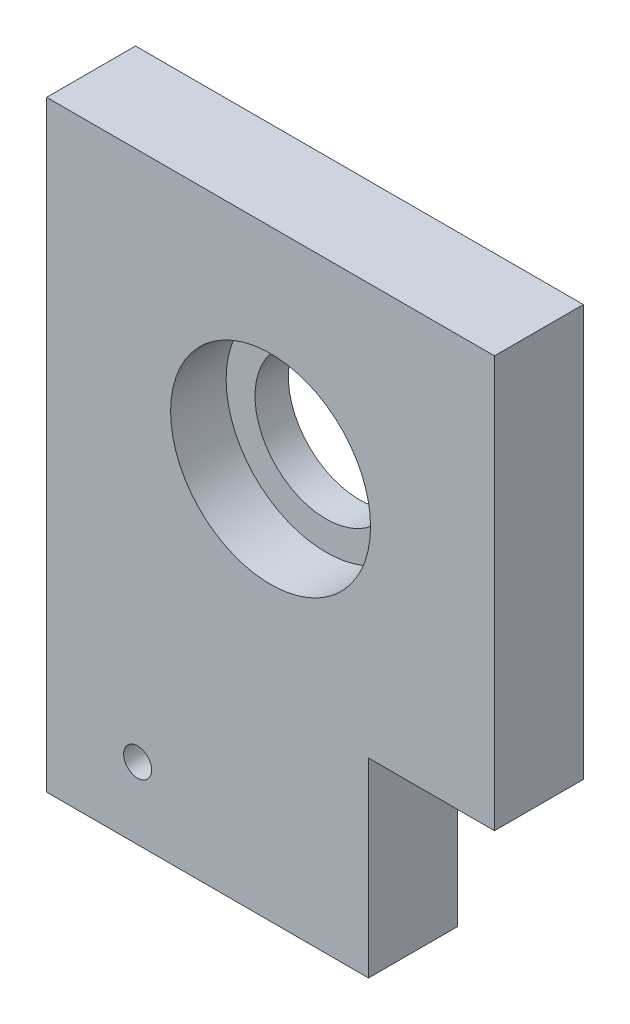
ISO-10303-21;
HEADER;
FILE_DESCRIPTION(('STEP AP214'),'2;1');
FILE_NAME('part.step','',(''),(''),'','','');
FILE_SCHEMA(('AUTOMOTIVE_DESIGN { 1 0 10303 214 1 1 1 1 }'));
ENDSEC;
DATA;
#1=APPLICATION_CONTEXT('core data for automotive mechanical design processes');
#2=APPLICATION_PROTOCOL_DEFINITION('international standard','automotive_design',2000,#1);
#3=PRODUCT_CONTEXT('',#1,'mechanical');
#4=PRODUCT('Part','Part','',(#3));
#5=PRODUCT_RELATED_PRODUCT_CATEGORY('part','',(#4));
#6=PRODUCT_DEFINITION_FORMATION('','',#4);
#7=PRODUCT_DEFINITION_CONTEXT('part definition',#1,'design');
#8=PRODUCT_DEFINITION('design','',#6,#7);
#9=PRODUCT_DEFINITION_SHAPE('','',#8);
#10=(LENGTH_UNIT() NAMED_UNIT(*) SI_UNIT(.MILLI.,.METRE.));
#11=(NAMED_UNIT(*) PLANE_ANGLE_UNIT() SI_UNIT($,.RADIAN.));
#12=(NAMED_UNIT(*) SI_UNIT($,.STERADIAN.) SOLID_ANGLE_UNIT());
#13=UNCERTAINTY_MEASURE_WITH_UNIT(LENGTH_MEASURE(1.E-05),#10,'distance_accuracy_value','');
#14=(GEOMETRIC_REPRESENTATION_CONTEXT(3) GLOBAL_UNCERTAINTY_ASSIGNED_CONTEXT((#13)) GLOBAL_UNIT_ASSIGNED_CONTEXT((#10,
#11,#12)) REPRESENTATION_CONTEXT('',''));
#15=CARTESIAN_POINT('',(0.,0.,0.));
#16=DIRECTION('',(0.,0.,1.));
#17=DIRECTION('',(1.,0.,0.));
#18=AXIS2_PLACEMENT_3D('',#15,#16,#17);
#19=CARTESIAN_POINT('',(0.,0.,12.7));
#20=DIRECTION('',(0.,0.,-1.));
#21=DIRECTION('',(-1.,0.,0.));
#22=AXIS2_PLACEMENT_3D('',#19,#20,#21);
#23=CYLINDRICAL_SURFACE('',#22,10.16);
#24=CARTESIAN_POINT('',(0.,0.,0.));
#25=DIRECTION('',(0.,0.,1.));
#26=DIRECTION('',(1.,0.,0.));
#27=AXIS2_PLACEMENT_3D('',#24,#25,#26);
#28=CIRCLE('',#27,10.16);
#29=CARTESIAN_POINT('',(10.16,0.,0.));
#30=VERTEX_POINT('',#29);
#31=EDGE_CURVE('E122',#30,#30,#28,.T.);
#32=ORIENTED_EDGE('',*,*,#31,.F.);
#33=EDGE_LOOP('',(#32));
#34=FACE_BOUND('',#33,.T.);
#35=CARTESIAN_POINT('',(0.,0.,4.7625));
#36=DIRECTION('',(0.,0.,1.));
#37=DIRECTION('',(1.,0.,0.));
#38=AXIS2_PLACEMENT_3D('',#35,#36,#37);
#39=CIRCLE('',#38,10.16);
#40=CARTESIAN_POINT('',(10.16,0.,4.7625));
#41=VERTEX_POINT('',#40);
#42=EDGE_CURVE('E36',#41,#41,#39,.T.);
#43=ORIENTED_EDGE('',*,*,#42,.T.);
#44=EDGE_LOOP('',(#43));
#45=FACE_BOUND('',#44,.T.);
#46=ADVANCED_FACE('F32',(#34,#45),#23,.F.);
#47=CARTESIAN_POINT('',(0.,0.,12.7));
#48=DIRECTION('',(0.,0.,1.));
#49=DIRECTION('',(1.,0.,0.));
#50=AXIS2_PLACEMENT_3D('',#47,#48,#49);
#51=PLANE('',#50);
#52=CARTESIAN_POINT('',(0.,0.,12.7));
#53=DIRECTION('',(0.,0.,1.));
#54=DIRECTION('',(1.,0.,0.));
#55=AXIS2_PLACEMENT_3D('',#52,#53,#54);
#56=CIRCLE('',#55,14.2875);
#57=CARTESIAN_POINT('',(14.2875,0.,12.7));
#58=VERTEX_POINT('',#57);
#59=EDGE_CURVE('E240',#58,#58,#56,.T.);
#60=ORIENTED_EDGE('',*,*,#59,.F.);
#61=EDGE_LOOP('',(#60));
#62=FACE_BOUND('',#61,.T.);
#63=DIRECTION('',(1.,0.,0.));
#64=VECTOR('',#63,1.);
#65=CARTESIAN_POINT('',(14.,-28.7749891398763,12.7));
#66=LINE('',#65,#64);
#67=CARTESIAN_POINT('',(14.,-28.7749891398763,12.7));
#68=VERTEX_POINT('',#67);
#69=CARTESIAN_POINT('',(32.,-28.7749891398763,12.7));
#70=VERTEX_POINT('',#69);
#71=EDGE_CURVE('E130',#68,#70,#66,.T.);
#72=ORIENTED_EDGE('',*,*,#71,.T.);
#73=DIRECTION('',(0.,1.,0.));
#74=VECTOR('',#73,1.);
#75=CARTESIAN_POINT('',(32.,-28.7749891398763,12.7));
#76=LINE('',#75,#74);
#77=CARTESIAN_POINT('',(32.,30.,12.7));
#78=VERTEX_POINT('',#77);
#79=EDGE_CURVE('E87',#70,#78,#76,.T.);
#80=ORIENTED_EDGE('',*,*,#79,.T.);
#81=DIRECTION('',(-1.,0.,0.));
#82=VECTOR('',#81,1.);
#83=CARTESIAN_POINT('',(32.,30.,12.7));
#84=LINE('',#83,#82);
#85=CARTESIAN_POINT('',(-32.,30.,12.7));
#86=VERTEX_POINT('',#85);
#87=EDGE_CURVE('E101',#78,#86,#84,.T.);
#88=ORIENTED_EDGE('',*,*,#87,.T.);
#89=DIRECTION('',(0.,-1.,0.));
#90=VECTOR('',#89,1.);
#91=CARTESIAN_POINT('',(-32.,30.,12.7));
#92=LINE('',#91,#90);
#93=CARTESIAN_POINT('',(-32.,-56.,12.7));
#94=VERTEX_POINT('',#93);
#95=EDGE_CURVE('E94',#86,#94,#92,.T.);
#96=ORIENTED_EDGE('',*,*,#95,.T.);
#97=DIRECTION('',(1.,0.,0.));
#98=VECTOR('',#97,1.);
#99=CARTESIAN_POINT('',(14.,-56.,12.7));
#100=LINE('',#99,#98);
#101=CARTESIAN_POINT('',(14.,-56.,12.7));
#102=VERTEX_POINT('',#101);
#103=EDGE_CURVE('E99',#94,#102,#100,.T.);
#104=ORIENTED_EDGE('',*,*,#103,.T.);
#105=DIRECTION('',(0.,1.,0.));
#106=VECTOR('',#105,1.);
#107=CARTESIAN_POINT('',(14.,-56.,12.7));
#108=LINE('',#107,#106);
#109=EDGE_CURVE('E50',#102,#68,#108,.T.);
#110=ORIENTED_EDGE('',*,*,#109,.T.);
#111=EDGE_LOOP('',(#72,#80,#88,#96,#104,#110));
#112=FACE_BOUND('',#111,.T.);
#113=CARTESIAN_POINT('',(-19.,-45.7749891398763,12.7));
#114=DIRECTION('',(0.,0.,1.));
#115=DIRECTION('',(1.,0.,0.));
#116=AXIS2_PLACEMENT_3D('',#113,#114,#115);
#117=CIRCLE('',#116,2.);
#118=CARTESIAN_POINT('',(-17.,-45.7749891398763,12.7));
#119=VERTEX_POINT('',#118);
#120=EDGE_CURVE('E246',#119,#119,#117,.T.);
#121=ORIENTED_EDGE('',*,*,#120,.F.);
#122=EDGE_LOOP('',(#121));
#123=FACE_BOUND('',#122,.T.);
#124=ADVANCED_FACE('F96',(#62,#112,#123),#51,.T.);
#125=CARTESIAN_POINT('',(0.,0.,0.));
#126=DIRECTION('',(0.,0.,1.));
#127=DIRECTION('',(1.,0.,0.));
#128=AXIS2_PLACEMENT_3D('',#125,#126,#127);
#129=PLANE('',#128);
#130=DIRECTION('',(1.,0.,0.));
#131=VECTOR('',#130,1.);
#132=CARTESIAN_POINT('',(14.,-28.7749891398763,0.));
#133=LINE('',#132,#131);
#134=CARTESIAN_POINT('',(14.,-28.7749891398763,0.));
#135=VERTEX_POINT('',#134);
#136=CARTESIAN_POINT('',(32.,-28.7749891398763,0.));
#137=VERTEX_POINT('',#136);
#138=EDGE_CURVE('E118',#135,#137,#133,.T.);
#139=ORIENTED_EDGE('',*,*,#138,.F.);
#140=DIRECTION('',(0.,1.,0.));
#141=VECTOR('',#140,1.);
#142=CARTESIAN_POINT('',(14.,-56.,0.));
#143=LINE('',#142,#141);
#144=CARTESIAN_POINT('',(14.,-56.,0.));
#145=VERTEX_POINT('',#144);
#146=EDGE_CURVE('E79',#145,#135,#143,.T.);
#147=ORIENTED_EDGE('',*,*,#146,.F.);
#148=DIRECTION('',(1.,0.,0.));
#149=VECTOR('',#148,1.);
#150=CARTESIAN_POINT('',(14.,-56.,0.));
#151=LINE('',#150,#149);
#152=CARTESIAN_POINT('',(-32.,-56.,0.));
#153=VERTEX_POINT('',#152);
#154=EDGE_CURVE('E73',#153,#145,#151,.T.);
#155=ORIENTED_EDGE('',*,*,#154,.F.);
#156=DIRECTION('',(0.,-1.,0.));
#157=VECTOR('',#156,1.);
#158=CARTESIAN_POINT('',(-32.,-56.,0.));
#159=LINE('',#158,#157);
#160=CARTESIAN_POINT('',(-32.,30.,0.));
#161=VERTEX_POINT('',#160);
#162=EDGE_CURVE('E108',#161,#153,#159,.T.);
#163=ORIENTED_EDGE('',*,*,#162,.F.);
#164=DIRECTION('',(-1.,0.,0.));
#165=VECTOR('',#164,1.);
#166=CARTESIAN_POINT('',(32.,30.,0.));
#167=LINE('',#166,#165);
#168=CARTESIAN_POINT('',(32.,30.,0.));
#169=VERTEX_POINT('',#168);
#170=EDGE_CURVE('E124',#169,#161,#167,.T.);
#171=ORIENTED_EDGE('',*,*,#170,.F.);
#172=DIRECTION('',(0.,1.,0.));
#173=VECTOR('',#172,1.);
#174=CARTESIAN_POINT('',(32.,-28.7749891398763,0.));
#175=LINE('',#174,#173);
#176=EDGE_CURVE('E121',#137,#169,#175,.T.);
#177=ORIENTED_EDGE('',*,*,#176,.F.);
#178=EDGE_LOOP('',(#139,#147,#155,#163,#171,#177));
#179=FACE_BOUND('',#178,.T.);
#180=ORIENTED_EDGE('',*,*,#31,.T.);
#181=EDGE_LOOP('',(#180));
#182=FACE_BOUND('',#181,.T.);
#183=CARTESIAN_POINT('',(-19.,-45.7749891398763,0.));
#184=DIRECTION('',(0.,0.,1.));
#185=DIRECTION('',(1.,0.,0.));
#186=AXIS2_PLACEMENT_3D('',#183,#184,#185);
#187=CIRCLE('',#186,2.);
#188=CARTESIAN_POINT('',(-17.,-45.7749891398763,0.));
#189=VERTEX_POINT('',#188);
#190=EDGE_CURVE('E242',#189,#189,#187,.T.);
#191=ORIENTED_EDGE('',*,*,#190,.T.);
#192=EDGE_LOOP('',(#191));
#193=FACE_BOUND('',#192,.T.);
#194=ADVANCED_FACE('F140',(#179,#182,#193),#129,.F.);
#195=CARTESIAN_POINT('',(14.,-28.7749891398763,12.7));
#196=DIRECTION('',(0.,1.,0.));
#197=DIRECTION('',(0.,0.,1.));
#198=AXIS2_PLACEMENT_3D('',#195,#196,#197);
#199=PLANE('',#198);
#200=ORIENTED_EDGE('',*,*,#138,.T.);
#201=DIRECTION('',(0.,0.,-1.));
#202=VECTOR('',#201,1.);
#203=CARTESIAN_POINT('',(32.,-28.7749891398763,12.7));
#204=LINE('',#203,#202);
#205=EDGE_CURVE('E11',#70,#137,#204,.T.);
#206=ORIENTED_EDGE('',*,*,#205,.F.);
#207=ORIENTED_EDGE('',*,*,#71,.F.);
#208=DIRECTION('',(0.,0.,-1.));
#209=VECTOR('',#208,1.);
#210=CARTESIAN_POINT('',(14.,-28.7749891398763,12.7));
#211=LINE('',#210,#209);
#212=EDGE_CURVE('E114',#68,#135,#211,.T.);
#213=ORIENTED_EDGE('',*,*,#212,.T.);
#214=EDGE_LOOP('',(#200,#206,#207,#213));
#215=FACE_BOUND('',#214,.T.);
#216=ADVANCED_FACE('F34',(#215),#199,.F.);
#217=CARTESIAN_POINT('',(32.,-28.7749891398763,12.7));
#218=DIRECTION('',(-1.,0.,0.));
#219=DIRECTION('',(0.,-1.,0.));
#220=AXIS2_PLACEMENT_3D('',#217,#218,#219);
#221=PLANE('',#220);
#222=ORIENTED_EDGE('',*,*,#176,.T.);
#223=DIRECTION('',(0.,0.,-1.));
#224=VECTOR('',#223,1.);
#225=CARTESIAN_POINT('',(32.,30.,12.7));
#226=LINE('',#225,#224);
#227=EDGE_CURVE('E42',#78,#169,#226,.T.);
#228=ORIENTED_EDGE('',*,*,#227,.F.);
#229=ORIENTED_EDGE('',*,*,#79,.F.);
#230=ORIENTED_EDGE('',*,*,#205,.T.);
#231=EDGE_LOOP('',(#222,#228,#229,#230));
#232=FACE_BOUND('',#231,.T.);
#233=ADVANCED_FACE('F173',(#232),#221,.F.);
#234=CARTESIAN_POINT('',(32.,30.,12.7));
#235=DIRECTION('',(0.,-1.,0.));
#236=DIRECTION('',(1.,0.,0.));
#237=AXIS2_PLACEMENT_3D('',#234,#235,#236);
#238=PLANE('',#237);
#239=ORIENTED_EDGE('',*,*,#170,.T.);
#240=DIRECTION('',(0.,0.,-1.));
#241=VECTOR('',#240,1.);
#242=CARTESIAN_POINT('',(-32.,30.,12.7));
#243=LINE('',#242,#241);
#244=EDGE_CURVE('E109',#86,#161,#243,.T.);
#245=ORIENTED_EDGE('',*,*,#244,.F.);
#246=ORIENTED_EDGE('',*,*,#87,.F.);
#247=ORIENTED_EDGE('',*,*,#227,.T.);
#248=EDGE_LOOP('',(#239,#245,#246,#247));
#249=FACE_BOUND('',#248,.T.);
#250=ADVANCED_FACE('F137',(#249),#238,.F.);
#251=CARTESIAN_POINT('',(-32.,-56.,12.7));
#252=DIRECTION('',(1.,0.,0.));
#253=DIRECTION('',(0.,1.,0.));
#254=AXIS2_PLACEMENT_3D('',#251,#252,#253);
#255=PLANE('',#254);
#256=ORIENTED_EDGE('',*,*,#162,.T.);
#257=DIRECTION('',(0.,0.,-1.));
#258=VECTOR('',#257,1.);
#259=CARTESIAN_POINT('',(-32.,-56.,12.7));
#260=LINE('',#259,#258);
#261=EDGE_CURVE('E106',#94,#153,#260,.T.);
#262=ORIENTED_EDGE('',*,*,#261,.F.);
#263=ORIENTED_EDGE('',*,*,#95,.F.);
#264=ORIENTED_EDGE('',*,*,#244,.T.);
#265=EDGE_LOOP('',(#256,#262,#263,#264));
#266=FACE_BOUND('',#265,.T.);
#267=ADVANCED_FACE('F107',(#266),#255,.F.);
#268=CARTESIAN_POINT('',(14.,-56.,12.7));
#269=DIRECTION('',(0.,1.,0.));
#270=DIRECTION('',(-1.,0.,0.));
#271=AXIS2_PLACEMENT_3D('',#268,#269,#270);
#272=PLANE('',#271);
#273=ORIENTED_EDGE('',*,*,#154,.T.);
#274=DIRECTION('',(0.,0.,-1.));
#275=VECTOR('',#274,1.);
#276=CARTESIAN_POINT('',(14.,-56.,12.7));
#277=LINE('',#276,#275);
#278=EDGE_CURVE('E110',#102,#145,#277,.T.);
#279=ORIENTED_EDGE('',*,*,#278,.F.);
#280=ORIENTED_EDGE('',*,*,#103,.F.);
#281=ORIENTED_EDGE('',*,*,#261,.T.);
#282=EDGE_LOOP('',(#273,#279,#280,#281));
#283=FACE_BOUND('',#282,.T.);
#284=ADVANCED_FACE('F112',(#283),#272,.F.);
#285=CARTESIAN_POINT('',(14.,-56.,12.7));
#286=DIRECTION('',(-1.,0.,0.));
#287=DIRECTION('',(0.,0.,1.));
#288=AXIS2_PLACEMENT_3D('',#285,#286,#287);
#289=PLANE('',#288);
#290=ORIENTED_EDGE('',*,*,#146,.T.);
#291=ORIENTED_EDGE('',*,*,#212,.F.);
#292=ORIENTED_EDGE('',*,*,#109,.F.);
#293=ORIENTED_EDGE('',*,*,#278,.T.);
#294=EDGE_LOOP('',(#290,#291,#292,#293));
#295=FACE_BOUND('',#294,.T.);
#296=ADVANCED_FACE('F145',(#295),#289,.F.);
#297=CARTESIAN_POINT('',(-19.,-45.7749891398763,12.7));
#298=DIRECTION('',(0.,0.,-1.));
#299=DIRECTION('',(-1.,0.,0.));
#300=AXIS2_PLACEMENT_3D('',#297,#298,#299);
#301=CYLINDRICAL_SURFACE('',#300,2.);
#302=ORIENTED_EDGE('',*,*,#120,.T.);
#303=EDGE_LOOP('',(#302));
#304=FACE_BOUND('',#303,.T.);
#305=ORIENTED_EDGE('',*,*,#190,.F.);
#306=EDGE_LOOP('',(#305));
#307=FACE_BOUND('',#306,.T.);
#308=ADVANCED_FACE('F147',(#304,#307),#301,.F.);
#309=CARTESIAN_POINT('',(0.,0.,4.7625));
#310=DIRECTION('',(0.,0.,1.));
#311=DIRECTION('',(1.,0.,0.));
#312=AXIS2_PLACEMENT_3D('',#309,#310,#311);
#313=CYLINDRICAL_SURFACE('',#312,14.2875);
#314=CARTESIAN_POINT('',(0.,0.,4.7625));
#315=DIRECTION('',(0.,0.,1.));
#316=DIRECTION('',(1.,0.,0.));
#317=AXIS2_PLACEMENT_3D('',#314,#315,#316);
#318=CIRCLE('',#317,14.2875);
#319=CARTESIAN_POINT('',(14.2875,0.,4.7625));
#320=VERTEX_POINT('',#319);
#321=EDGE_CURVE('E239',#320,#320,#318,.T.);
#322=ORIENTED_EDGE('',*,*,#321,.F.);
#323=EDGE_LOOP('',(#322));
#324=FACE_BOUND('',#323,.T.);
#325=ORIENTED_EDGE('',*,*,#59,.T.);
#326=EDGE_LOOP('',(#325));
#327=FACE_BOUND('',#326,.T.);
#328=ADVANCED_FACE('F153',(#324,#327),#313,.F.);
#329=CARTESIAN_POINT('',(0.,0.,4.7625));
#330=DIRECTION('',(0.,0.,1.));
#331=DIRECTION('',(1.,0.,0.));
#332=AXIS2_PLACEMENT_3D('',#329,#330,#331);
#333=PLANE('',#332);
#334=ORIENTED_EDGE('',*,*,#42,.F.);
#335=EDGE_LOOP('',(#334));
#336=FACE_BOUND('',#335,.T.);
#337=ORIENTED_EDGE('',*,*,#321,.T.);
#338=EDGE_LOOP('',(#337));
#339=FACE_BOUND('',#338,.T.);
#340=ADVANCED_FACE('F221',(#336,#339),#333,.T.);
#341=CLOSED_SHELL('',(#46,#124,#194,#216,#233,#250,#267,#284,#296,#308,#328,#340));
#342=MANIFOLD_SOLID_BREP('B2',#341);
#343=ADVANCED_BREP_SHAPE_REPRESENTATION('',(#18,#342),#14);
#344=SHAPE_DEFINITION_REPRESENTATION(#9,#343);
ENDSEC;
END-ISO-10303-21;
